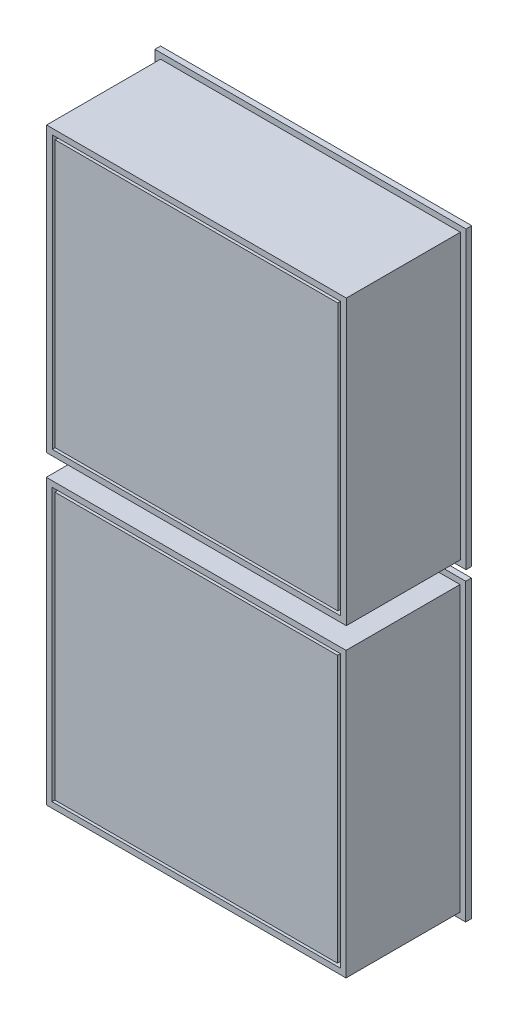
ISO-10303-21;
HEADER;
FILE_DESCRIPTION(('STEP AP214'),'2;1');
FILE_NAME('part.step','',(''),(''),'','','');
FILE_SCHEMA(('AUTOMOTIVE_DESIGN { 1 0 10303 214 1 1 1 1 }'));
ENDSEC;
DATA;
#1=APPLICATION_CONTEXT('core data for automotive mechanical design processes');
#2=APPLICATION_PROTOCOL_DEFINITION('international standard','automotive_design',2000,#1);
#3=PRODUCT_CONTEXT('',#1,'mechanical');
#4=PRODUCT('Part','Part','',(#3));
#5=PRODUCT_RELATED_PRODUCT_CATEGORY('part','',(#4));
#6=PRODUCT_DEFINITION_FORMATION('','',#4);
#7=PRODUCT_DEFINITION_CONTEXT('part definition',#1,'design');
#8=PRODUCT_DEFINITION('design','',#6,#7);
#9=PRODUCT_DEFINITION_SHAPE('','',#8);
#10=(LENGTH_UNIT() NAMED_UNIT(*) SI_UNIT(.MILLI.,.METRE.));
#11=(NAMED_UNIT(*) PLANE_ANGLE_UNIT() SI_UNIT($,.RADIAN.));
#12=(NAMED_UNIT(*) SI_UNIT($,.STERADIAN.) SOLID_ANGLE_UNIT());
#13=UNCERTAINTY_MEASURE_WITH_UNIT(LENGTH_MEASURE(1.E-05),#10,'distance_accuracy_value','');
#14=(GEOMETRIC_REPRESENTATION_CONTEXT(3) GLOBAL_UNCERTAINTY_ASSIGNED_CONTEXT((#13)) GLOBAL_UNIT_ASSIGNED_CONTEXT((#10,
#11,#12)) REPRESENTATION_CONTEXT('',''));
#15=CARTESIAN_POINT('',(0.,0.,0.));
#16=DIRECTION('',(0.,0.,1.));
#17=DIRECTION('',(1.,0.,0.));
#18=AXIS2_PLACEMENT_3D('',#15,#16,#17);
#19=CARTESIAN_POINT('',(-26.4387864536096,-13.9806319519483,20.));
#20=DIRECTION('',(1.,0.,0.));
#21=DIRECTION('',(0.,1.,0.));
#22=AXIS2_PLACEMENT_3D('',#19,#20,#21);
#23=PLANE('',#22);
#24=DIRECTION('',(0.,-1.,0.));
#25=VECTOR('',#24,1.);
#26=CARTESIAN_POINT('',(-26.4387864536096,-13.9806319519483,0.));
#27=LINE('',#26,#25);
#28=CARTESIAN_POINT('',(-26.4387864536096,-13.9806319519483,0.));
#29=VERTEX_POINT('',#28);
#30=CARTESIAN_POINT('',(-26.4387864536096,-63.7589492543294,0.));
#31=VERTEX_POINT('',#30);
#32=EDGE_CURVE('E173',#29,#31,#27,.T.);
#33=ORIENTED_EDGE('',*,*,#32,.T.);
#34=DIRECTION('',(0.,0.,-1.));
#35=VECTOR('',#34,1.);
#36=CARTESIAN_POINT('',(-26.4387864536096,-63.7589492543294,20.));
#37=LINE('',#36,#35);
#38=CARTESIAN_POINT('',(-26.4387864536096,-63.7589492543294,20.));
#39=VERTEX_POINT('',#38);
#40=EDGE_CURVE('E180',#39,#31,#37,.T.);
#41=ORIENTED_EDGE('',*,*,#40,.F.);
#42=DIRECTION('',(0.,-1.,0.));
#43=VECTOR('',#42,1.);
#44=CARTESIAN_POINT('',(-26.4387864536096,-13.9806319519483,20.));
#45=LINE('',#44,#43);
#46=CARTESIAN_POINT('',(-26.4387864536096,-13.9806319519483,20.));
#47=VERTEX_POINT('',#46);
#48=EDGE_CURVE('E111',#47,#39,#45,.T.);
#49=ORIENTED_EDGE('',*,*,#48,.F.);
#50=DIRECTION('',(0.,0.,-1.));
#51=VECTOR('',#50,1.);
#52=CARTESIAN_POINT('',(-26.4387864536096,-13.9806319519483,20.));
#53=LINE('',#52,#51);
#54=EDGE_CURVE('E176',#47,#29,#53,.T.);
#55=ORIENTED_EDGE('',*,*,#54,.T.);
#56=EDGE_LOOP('',(#33,#41,#49,#55));
#57=FACE_BOUND('',#56,.T.);
#58=ADVANCED_FACE('F46',(#57),#23,.F.);
#59=CARTESIAN_POINT('',(26.1453716756386,-63.7589492543294,20.));
#60=DIRECTION('',(0.,1.,0.));
#61=DIRECTION('',(0.,0.,1.));
#62=AXIS2_PLACEMENT_3D('',#59,#60,#61);
#63=PLANE('',#62);
#64=DIRECTION('',(1.,0.,0.));
#65=VECTOR('',#64,1.);
#66=CARTESIAN_POINT('',(26.1453716756386,-63.7589492543294,0.));
#67=LINE('',#66,#65);
#68=CARTESIAN_POINT('',(26.1453716756386,-63.7589492543294,0.));
#69=VERTEX_POINT('',#68);
#70=EDGE_CURVE('E177',#31,#69,#67,.T.);
#71=ORIENTED_EDGE('',*,*,#70,.T.);
#72=DIRECTION('',(0.,0.,-1.));
#73=VECTOR('',#72,1.);
#74=CARTESIAN_POINT('',(26.1453716756386,-63.7589492543294,20.));
#75=LINE('',#74,#73);
#76=CARTESIAN_POINT('',(26.1453716756386,-63.7589492543294,20.));
#77=VERTEX_POINT('',#76);
#78=EDGE_CURVE('E184',#77,#69,#75,.T.);
#79=ORIENTED_EDGE('',*,*,#78,.F.);
#80=DIRECTION('',(1.,0.,0.));
#81=VECTOR('',#80,1.);
#82=CARTESIAN_POINT('',(26.1453716756386,-63.7589492543294,20.));
#83=LINE('',#82,#81);
#84=EDGE_CURVE('E165',#39,#77,#83,.T.);
#85=ORIENTED_EDGE('',*,*,#84,.F.);
#86=ORIENTED_EDGE('',*,*,#40,.T.);
#87=EDGE_LOOP('',(#71,#79,#85,#86));
#88=FACE_BOUND('',#87,.T.);
#89=ADVANCED_FACE('F199',(#88),#63,.F.);
#90=CARTESIAN_POINT('',(26.1453716756386,-13.9806319519483,20.));
#91=DIRECTION('',(-1.,0.,0.));
#92=DIRECTION('',(0.,-1.,0.));
#93=AXIS2_PLACEMENT_3D('',#90,#91,#92);
#94=PLANE('',#93);
#95=DIRECTION('',(0.,1.,0.));
#96=VECTOR('',#95,1.);
#97=CARTESIAN_POINT('',(26.1453716756386,-13.9806319519483,0.));
#98=LINE('',#97,#96);
#99=CARTESIAN_POINT('',(26.1453716756386,-13.9806319519483,0.));
#100=VERTEX_POINT('',#99);
#101=EDGE_CURVE('E181',#69,#100,#98,.T.);
#102=ORIENTED_EDGE('',*,*,#101,.T.);
#103=DIRECTION('',(0.,0.,-1.));
#104=VECTOR('',#103,1.);
#105=CARTESIAN_POINT('',(26.1453716756386,-13.9806319519483,20.));
#106=LINE('',#105,#104);
#107=CARTESIAN_POINT('',(26.1453716756386,-13.9806319519483,20.));
#108=VERTEX_POINT('',#107);
#109=EDGE_CURVE('E109',#108,#100,#106,.T.);
#110=ORIENTED_EDGE('',*,*,#109,.F.);
#111=DIRECTION('',(0.,1.,0.));
#112=VECTOR('',#111,1.);
#113=CARTESIAN_POINT('',(26.1453716756386,-13.9806319519483,20.));
#114=LINE('',#113,#112);
#115=EDGE_CURVE('E168',#77,#108,#114,.T.);
#116=ORIENTED_EDGE('',*,*,#115,.F.);
#117=ORIENTED_EDGE('',*,*,#78,.T.);
#118=EDGE_LOOP('',(#102,#110,#116,#117));
#119=FACE_BOUND('',#118,.T.);
#120=ADVANCED_FACE('F228',(#119),#94,.F.);
#121=CARTESIAN_POINT('',(26.1453716756386,-13.9806319519483,20.));
#122=DIRECTION('',(0.,-1.,0.));
#123=DIRECTION('',(1.,0.,0.));
#124=AXIS2_PLACEMENT_3D('',#121,#122,#123);
#125=PLANE('',#124);
#126=DIRECTION('',(-1.,0.,0.));
#127=VECTOR('',#126,1.);
#128=CARTESIAN_POINT('',(26.1453716756386,-13.9806319519483,0.));
#129=LINE('',#128,#127);
#130=EDGE_CURVE('E185',#100,#29,#129,.T.);
#131=ORIENTED_EDGE('',*,*,#130,.T.);
#132=ORIENTED_EDGE('',*,*,#54,.F.);
#133=DIRECTION('',(-1.,0.,0.));
#134=VECTOR('',#133,1.);
#135=CARTESIAN_POINT('',(26.1453716756386,-13.9806319519483,20.));
#136=LINE('',#135,#134);
#137=EDGE_CURVE('E143',#108,#47,#136,.T.);
#138=ORIENTED_EDGE('',*,*,#137,.F.);
#139=ORIENTED_EDGE('',*,*,#109,.T.);
#140=EDGE_LOOP('',(#131,#132,#138,#139));
#141=FACE_BOUND('',#140,.T.);
#142=ADVANCED_FACE('F220',(#141),#125,.F.);
#143=CARTESIAN_POINT('',(0.,0.,20.));
#144=DIRECTION('',(0.,0.,-1.));
#145=DIRECTION('',(-1.,0.,0.));
#146=AXIS2_PLACEMENT_3D('',#143,#144,#145);
#147=PLANE('',#146);
#148=DIRECTION('',(0.,1.,0.));
#149=VECTOR('',#148,1.);
#150=CARTESIAN_POINT('',(-25.4387864536096,-62.7589492543294,20.));
#151=LINE('',#150,#149);
#152=CARTESIAN_POINT('',(-25.4387864536096,-62.7589492543294,20.));
#153=VERTEX_POINT('',#152);
#154=CARTESIAN_POINT('',(-25.4387864536096,-14.9806319519483,20.));
#155=VERTEX_POINT('',#154);
#156=EDGE_CURVE('E87',#153,#155,#151,.T.);
#157=ORIENTED_EDGE('',*,*,#156,.T.);
#158=DIRECTION('',(1.,0.,0.));
#159=VECTOR('',#158,1.);
#160=CARTESIAN_POINT('',(-25.4387864536096,-14.9806319519483,20.));
#161=LINE('',#160,#159);
#162=CARTESIAN_POINT('',(25.1453716756386,-14.9806319519483,20.));
#163=VERTEX_POINT('',#162);
#164=EDGE_CURVE('E50',#155,#163,#161,.T.);
#165=ORIENTED_EDGE('',*,*,#164,.T.);
#166=DIRECTION('',(0.,-1.,0.));
#167=VECTOR('',#166,1.);
#168=CARTESIAN_POINT('',(25.1453716756386,-14.9806319519483,20.));
#169=LINE('',#168,#167);
#170=CARTESIAN_POINT('',(25.1453716756386,-62.7589492543294,20.));
#171=VERTEX_POINT('',#170);
#172=EDGE_CURVE('E112',#163,#171,#169,.T.);
#173=ORIENTED_EDGE('',*,*,#172,.T.);
#174=DIRECTION('',(-1.,0.,0.));
#175=VECTOR('',#174,1.);
#176=CARTESIAN_POINT('',(25.1453716756386,-62.7589492543294,20.));
#177=LINE('',#176,#175);
#178=EDGE_CURVE('E110',#171,#153,#177,.T.);
#179=ORIENTED_EDGE('',*,*,#178,.T.);
#180=EDGE_LOOP('',(#157,#165,#173,#179));
#181=FACE_BOUND('',#180,.T.);
#182=ORIENTED_EDGE('',*,*,#48,.T.);
#183=ORIENTED_EDGE('',*,*,#84,.T.);
#184=ORIENTED_EDGE('',*,*,#115,.T.);
#185=ORIENTED_EDGE('',*,*,#137,.T.);
#186=EDGE_LOOP('',(#182,#183,#184,#185));
#187=FACE_BOUND('',#186,.T.);
#188=ADVANCED_FACE('F48',(#181,#187),#147,.F.);
#189=CARTESIAN_POINT('',(27.1453716756386,-12.9806319519483,-1.));
#190=DIRECTION('',(-1.,0.,0.));
#191=DIRECTION('',(0.,-1.,0.));
#192=AXIS2_PLACEMENT_3D('',#189,#190,#191);
#193=PLANE('',#192);
#194=DIRECTION('',(0.,-1.,0.));
#195=VECTOR('',#194,1.);
#196=CARTESIAN_POINT('',(27.1453716756386,-12.9806319519483,0.));
#197=LINE('',#196,#195);
#198=CARTESIAN_POINT('',(27.1453716756386,-12.9806319519483,0.));
#199=VERTEX_POINT('',#198);
#200=CARTESIAN_POINT('',(27.1453716756386,-64.7589492543294,0.));
#201=VERTEX_POINT('',#200);
#202=EDGE_CURVE('E139',#199,#201,#197,.T.);
#203=ORIENTED_EDGE('',*,*,#202,.T.);
#204=DIRECTION('',(0.,0.,1.));
#205=VECTOR('',#204,1.);
#206=CARTESIAN_POINT('',(27.1453716756386,-64.7589492543294,-1.));
#207=LINE('',#206,#205);
#208=CARTESIAN_POINT('',(27.1453716756386,-64.7589492543294,-1.));
#209=VERTEX_POINT('',#208);
#210=EDGE_CURVE('E147',#209,#201,#207,.T.);
#211=ORIENTED_EDGE('',*,*,#210,.F.);
#212=DIRECTION('',(0.,-1.,0.));
#213=VECTOR('',#212,1.);
#214=CARTESIAN_POINT('',(27.1453716756386,-12.9806319519483,-1.));
#215=LINE('',#214,#213);
#216=CARTESIAN_POINT('',(27.1453716756386,-12.9806319519483,-1.));
#217=VERTEX_POINT('',#216);
#218=EDGE_CURVE('E127',#217,#209,#215,.T.);
#219=ORIENTED_EDGE('',*,*,#218,.F.);
#220=DIRECTION('',(0.,0.,1.));
#221=VECTOR('',#220,1.);
#222=CARTESIAN_POINT('',(27.1453716756386,-12.9806319519483,-1.));
#223=LINE('',#222,#221);
#224=EDGE_CURVE('E142',#217,#199,#223,.T.);
#225=ORIENTED_EDGE('',*,*,#224,.T.);
#226=EDGE_LOOP('',(#203,#211,#219,#225));
#227=FACE_BOUND('',#226,.T.);
#228=ADVANCED_FACE('F260',(#227),#193,.F.);
#229=CARTESIAN_POINT('',(27.1453716756386,-64.7589492543294,-1.));
#230=DIRECTION('',(0.,1.,0.));
#231=DIRECTION('',(0.,0.,1.));
#232=AXIS2_PLACEMENT_3D('',#229,#230,#231);
#233=PLANE('',#232);
#234=DIRECTION('',(-1.,0.,0.));
#235=VECTOR('',#234,1.);
#236=CARTESIAN_POINT('',(27.1453716756386,-64.7589492543294,0.));
#237=LINE('',#236,#235);
#238=CARTESIAN_POINT('',(-27.4387864536096,-64.7589492543294,0.));
#239=VERTEX_POINT('',#238);
#240=EDGE_CURVE('E144',#201,#239,#237,.T.);
#241=ORIENTED_EDGE('',*,*,#240,.T.);
#242=DIRECTION('',(0.,0.,1.));
#243=VECTOR('',#242,1.);
#244=CARTESIAN_POINT('',(-27.4387864536096,-64.7589492543294,-1.));
#245=LINE('',#244,#243);
#246=CARTESIAN_POINT('',(-27.4387864536096,-64.7589492543294,-1.));
#247=VERTEX_POINT('',#246);
#248=EDGE_CURVE('E151',#247,#239,#245,.T.);
#249=ORIENTED_EDGE('',*,*,#248,.F.);
#250=DIRECTION('',(-1.,0.,0.));
#251=VECTOR('',#250,1.);
#252=CARTESIAN_POINT('',(27.1453716756386,-64.7589492543294,-1.));
#253=LINE('',#252,#251);
#254=EDGE_CURVE('E130',#209,#247,#253,.T.);
#255=ORIENTED_EDGE('',*,*,#254,.F.);
#256=ORIENTED_EDGE('',*,*,#210,.T.);
#257=EDGE_LOOP('',(#241,#249,#255,#256));
#258=FACE_BOUND('',#257,.T.);
#259=ADVANCED_FACE('F253',(#258),#233,.F.);
#260=CARTESIAN_POINT('',(-27.4387864536096,-64.7589492543294,-1.));
#261=DIRECTION('',(1.,0.,0.));
#262=DIRECTION('',(0.,1.,0.));
#263=AXIS2_PLACEMENT_3D('',#260,#261,#262);
#264=PLANE('',#263);
#265=DIRECTION('',(0.,1.,0.));
#266=VECTOR('',#265,1.);
#267=CARTESIAN_POINT('',(-27.4387864536096,-64.7589492543294,0.));
#268=LINE('',#267,#266);
#269=CARTESIAN_POINT('',(-27.4387864536096,-12.9806319519483,0.));
#270=VERTEX_POINT('',#269);
#271=EDGE_CURVE('E148',#239,#270,#268,.T.);
#272=ORIENTED_EDGE('',*,*,#271,.T.);
#273=DIRECTION('',(0.,0.,1.));
#274=VECTOR('',#273,1.);
#275=CARTESIAN_POINT('',(-27.4387864536096,-12.9806319519483,-1.));
#276=LINE('',#275,#274);
#277=CARTESIAN_POINT('',(-27.4387864536096,-12.9806319519483,-1.));
#278=VERTEX_POINT('',#277);
#279=EDGE_CURVE('E131',#278,#270,#276,.T.);
#280=ORIENTED_EDGE('',*,*,#279,.F.);
#281=DIRECTION('',(0.,1.,0.));
#282=VECTOR('',#281,1.);
#283=CARTESIAN_POINT('',(-27.4387864536096,-64.7589492543294,-1.));
#284=LINE('',#283,#282);
#285=EDGE_CURVE('E134',#247,#278,#284,.T.);
#286=ORIENTED_EDGE('',*,*,#285,.F.);
#287=ORIENTED_EDGE('',*,*,#248,.T.);
#288=EDGE_LOOP('',(#272,#280,#286,#287));
#289=FACE_BOUND('',#288,.T.);
#290=ADVANCED_FACE('F265',(#289),#264,.F.);
#291=CARTESIAN_POINT('',(-27.4387864536096,-12.9806319519483,-1.));
#292=DIRECTION('',(0.,-1.,0.));
#293=DIRECTION('',(1.,0.,0.));
#294=AXIS2_PLACEMENT_3D('',#291,#292,#293);
#295=PLANE('',#294);
#296=DIRECTION('',(1.,0.,0.));
#297=VECTOR('',#296,1.);
#298=CARTESIAN_POINT('',(-27.4387864536096,-12.9806319519483,0.));
#299=LINE('',#298,#297);
#300=EDGE_CURVE('E152',#270,#199,#299,.T.);
#301=ORIENTED_EDGE('',*,*,#300,.T.);
#302=ORIENTED_EDGE('',*,*,#224,.F.);
#303=DIRECTION('',(1.,0.,0.));
#304=VECTOR('',#303,1.);
#305=CARTESIAN_POINT('',(-27.4387864536096,-12.9806319519483,-1.));
#306=LINE('',#305,#304);
#307=EDGE_CURVE('E107',#278,#217,#306,.T.);
#308=ORIENTED_EDGE('',*,*,#307,.F.);
#309=ORIENTED_EDGE('',*,*,#279,.T.);
#310=EDGE_LOOP('',(#301,#302,#308,#309));
#311=FACE_BOUND('',#310,.T.);
#312=ADVANCED_FACE('F268',(#311),#295,.F.);
#313=CARTESIAN_POINT('',(0.,0.,-1.));
#314=DIRECTION('',(0.,0.,-1.));
#315=DIRECTION('',(-1.,0.,0.));
#316=AXIS2_PLACEMENT_3D('',#313,#314,#315);
#317=PLANE('',#316);
#318=DIRECTION('',(1.,0.,0.));
#319=VECTOR('',#318,1.);
#320=CARTESIAN_POINT('',(-25.4387864536096,-14.9806319519483,-1.));
#321=LINE('',#320,#319);
#322=CARTESIAN_POINT('',(-25.4387864536096,-14.9806319519483,-1.));
#323=VERTEX_POINT('',#322);
#324=CARTESIAN_POINT('',(25.1453716756386,-14.9806319519483,-1.));
#325=VERTEX_POINT('',#324);
#326=EDGE_CURVE('E99',#323,#325,#321,.T.);
#327=ORIENTED_EDGE('',*,*,#326,.F.);
#328=DIRECTION('',(0.,1.,0.));
#329=VECTOR('',#328,1.);
#330=CARTESIAN_POINT('',(-25.4387864536096,-62.7589492543294,-1.));
#331=LINE('',#330,#329);
#332=CARTESIAN_POINT('',(-25.4387864536096,-62.7589492543294,-1.));
#333=VERTEX_POINT('',#332);
#334=EDGE_CURVE('E84',#333,#323,#331,.T.);
#335=ORIENTED_EDGE('',*,*,#334,.F.);
#336=DIRECTION('',(-1.,0.,0.));
#337=VECTOR('',#336,1.);
#338=CARTESIAN_POINT('',(25.1453716756386,-62.7589492543294,-1.));
#339=LINE('',#338,#337);
#340=CARTESIAN_POINT('',(25.1453716756386,-62.7589492543294,-1.));
#341=VERTEX_POINT('',#340);
#342=EDGE_CURVE('E89',#341,#333,#339,.T.);
#343=ORIENTED_EDGE('',*,*,#342,.F.);
#344=DIRECTION('',(0.,-1.,0.));
#345=VECTOR('',#344,1.);
#346=CARTESIAN_POINT('',(25.1453716756386,-14.9806319519483,-1.));
#347=LINE('',#346,#345);
#348=EDGE_CURVE('E56',#325,#341,#347,.T.);
#349=ORIENTED_EDGE('',*,*,#348,.F.);
#350=EDGE_LOOP('',(#327,#335,#343,#349));
#351=FACE_BOUND('',#350,.T.);
#352=ORIENTED_EDGE('',*,*,#218,.T.);
#353=ORIENTED_EDGE('',*,*,#254,.T.);
#354=ORIENTED_EDGE('',*,*,#285,.T.);
#355=ORIENTED_EDGE('',*,*,#307,.T.);
#356=EDGE_LOOP('',(#352,#353,#354,#355));
#357=FACE_BOUND('',#356,.T.);
#358=ADVANCED_FACE('F96',(#351,#357),#317,.T.);
#359=CARTESIAN_POINT('',(0.,0.,0.));
#360=DIRECTION('',(0.,0.,-1.));
#361=DIRECTION('',(-1.,0.,0.));
#362=AXIS2_PLACEMENT_3D('',#359,#360,#361);
#363=PLANE('',#362);
#364=ORIENTED_EDGE('',*,*,#32,.F.);
#365=ORIENTED_EDGE('',*,*,#130,.F.);
#366=ORIENTED_EDGE('',*,*,#101,.F.);
#367=ORIENTED_EDGE('',*,*,#70,.F.);
#368=EDGE_LOOP('',(#364,#365,#366,#367));
#369=FACE_BOUND('',#368,.T.);
#370=ORIENTED_EDGE('',*,*,#202,.F.);
#371=ORIENTED_EDGE('',*,*,#300,.F.);
#372=ORIENTED_EDGE('',*,*,#271,.F.);
#373=ORIENTED_EDGE('',*,*,#240,.F.);
#374=EDGE_LOOP('',(#370,#371,#372,#373));
#375=FACE_BOUND('',#374,.T.);
#376=ADVANCED_FACE('F213',(#369,#375),#363,.F.);
#377=CARTESIAN_POINT('',(-25.4387864536096,-14.9806319519483,20.));
#378=DIRECTION('',(0.,1.,0.));
#379=DIRECTION('',(-1.,0.,0.));
#380=AXIS2_PLACEMENT_3D('',#377,#378,#379);
#381=PLANE('',#380);
#382=ORIENTED_EDGE('',*,*,#326,.T.);
#383=DIRECTION('',(0.,0.,-1.));
#384=VECTOR('',#383,1.);
#385=CARTESIAN_POINT('',(25.1453716756386,-14.9806319519483,20.));
#386=LINE('',#385,#384);
#387=EDGE_CURVE('E12',#163,#325,#386,.T.);
#388=ORIENTED_EDGE('',*,*,#387,.F.);
#389=ORIENTED_EDGE('',*,*,#164,.F.);
#390=DIRECTION('',(0.,0.,-1.));
#391=VECTOR('',#390,1.);
#392=CARTESIAN_POINT('',(-25.4387864536096,-14.9806319519483,20.));
#393=LINE('',#392,#391);
#394=EDGE_CURVE('E100',#155,#323,#393,.T.);
#395=ORIENTED_EDGE('',*,*,#394,.T.);
#396=EDGE_LOOP('',(#382,#388,#389,#395));
#397=FACE_BOUND('',#396,.T.);
#398=ADVANCED_FACE('F122',(#397),#381,.F.);
#399=CARTESIAN_POINT('',(-25.4387864536096,-62.7589492543294,20.));
#400=DIRECTION('',(-1.,0.,0.));
#401=DIRECTION('',(0.,-1.,0.));
#402=AXIS2_PLACEMENT_3D('',#399,#400,#401);
#403=PLANE('',#402);
#404=ORIENTED_EDGE('',*,*,#334,.T.);
#405=ORIENTED_EDGE('',*,*,#394,.F.);
#406=ORIENTED_EDGE('',*,*,#156,.F.);
#407=DIRECTION('',(0.,0.,-1.));
#408=VECTOR('',#407,1.);
#409=CARTESIAN_POINT('',(-25.4387864536096,-62.7589492543294,20.));
#410=LINE('',#409,#408);
#411=EDGE_CURVE('E78',#153,#333,#410,.T.);
#412=ORIENTED_EDGE('',*,*,#411,.T.);
#413=EDGE_LOOP('',(#404,#405,#406,#412));
#414=FACE_BOUND('',#413,.T.);
#415=ADVANCED_FACE('F82',(#414),#403,.F.);
#416=CARTESIAN_POINT('',(25.1453716756386,-62.7589492543294,20.));
#417=DIRECTION('',(0.,-1.,0.));
#418=DIRECTION('',(0.,0.,-1.));
#419=AXIS2_PLACEMENT_3D('',#416,#417,#418);
#420=PLANE('',#419);
#421=ORIENTED_EDGE('',*,*,#342,.T.);
#422=ORIENTED_EDGE('',*,*,#411,.F.);
#423=ORIENTED_EDGE('',*,*,#178,.F.);
#424=DIRECTION('',(0.,0.,-1.));
#425=VECTOR('',#424,1.);
#426=CARTESIAN_POINT('',(25.1453716756386,-62.7589492543294,20.));
#427=LINE('',#426,#425);
#428=EDGE_CURVE('E65',#171,#341,#427,.T.);
#429=ORIENTED_EDGE('',*,*,#428,.T.);
#430=EDGE_LOOP('',(#421,#422,#423,#429));
#431=FACE_BOUND('',#430,.T.);
#432=ADVANCED_FACE('F92',(#431),#420,.F.);
#433=CARTESIAN_POINT('',(25.1453716756386,-14.9806319519483,20.));
#434=DIRECTION('',(1.,0.,0.));
#435=DIRECTION('',(0.,1.,0.));
#436=AXIS2_PLACEMENT_3D('',#433,#434,#435);
#437=PLANE('',#436);
#438=ORIENTED_EDGE('',*,*,#348,.T.);
#439=ORIENTED_EDGE('',*,*,#428,.F.);
#440=ORIENTED_EDGE('',*,*,#172,.F.);
#441=ORIENTED_EDGE('',*,*,#387,.T.);
#442=EDGE_LOOP('',(#438,#439,#440,#441));
#443=FACE_BOUND('',#442,.T.);
#444=ADVANCED_FACE('F124',(#443),#437,.F.);
#445=CLOSED_SHELL('',(#58,#89,#120,#142,#188,#228,#259,#290,#312,#358,#376,#398,#415,#432,#444));
#446=MANIFOLD_SOLID_BREP('B2',#445);
#447=CARTESIAN_POINT('',(-26.3854472018753,39.5674846662498,20.));
#448=DIRECTION('',(1.,0.,0.));
#449=DIRECTION('',(0.,1.,0.));
#450=AXIS2_PLACEMENT_3D('',#447,#448,#449);
#451=PLANE('',#450);
#452=DIRECTION('',(0.,-1.,0.));
#453=VECTOR('',#452,1.);
#454=CARTESIAN_POINT('',(-26.3854472018753,39.5674846662498,0.));
#455=LINE('',#454,#453);
#456=CARTESIAN_POINT('',(-26.3854472018753,39.5674846662498,0.));
#457=VERTEX_POINT('',#456);
#458=CARTESIAN_POINT('',(-26.3854472018753,-10.2108326361312,0.));
#459=VERTEX_POINT('',#458);
#460=EDGE_CURVE('E528',#457,#459,#455,.T.);
#461=ORIENTED_EDGE('',*,*,#460,.T.);
#462=DIRECTION('',(0.,0.,-1.));
#463=VECTOR('',#462,1.);
#464=CARTESIAN_POINT('',(-26.3854472018753,-10.2108326361312,20.));
#465=LINE('',#464,#463);
#466=CARTESIAN_POINT('',(-26.3854472018753,-10.2108326361312,20.));
#467=VERTEX_POINT('',#466);
#468=EDGE_CURVE('E535',#467,#459,#465,.T.);
#469=ORIENTED_EDGE('',*,*,#468,.F.);
#470=DIRECTION('',(0.,-1.,0.));
#471=VECTOR('',#470,1.);
#472=CARTESIAN_POINT('',(-26.3854472018753,39.5674846662498,20.));
#473=LINE('',#472,#471);
#474=CARTESIAN_POINT('',(-26.3854472018753,39.5674846662498,20.));
#475=VERTEX_POINT('',#474);
#476=EDGE_CURVE('E466',#475,#467,#473,.T.);
#477=ORIENTED_EDGE('',*,*,#476,.F.);
#478=DIRECTION('',(0.,0.,-1.));
#479=VECTOR('',#478,1.);
#480=CARTESIAN_POINT('',(-26.3854472018753,39.5674846662498,20.));
#481=LINE('',#480,#479);
#482=EDGE_CURVE('E531',#475,#457,#481,.T.);
#483=ORIENTED_EDGE('',*,*,#482,.T.);
#484=EDGE_LOOP('',(#461,#469,#477,#483));
#485=FACE_BOUND('',#484,.T.);
#486=ADVANCED_FACE('F401',(#485),#451,.F.);
#487=CARTESIAN_POINT('',(26.1987109273726,-10.2108326361312,20.));
#488=DIRECTION('',(0.,1.,0.));
#489=DIRECTION('',(-1.,0.,0.));
#490=AXIS2_PLACEMENT_3D('',#487,#488,#489);
#491=PLANE('',#490);
#492=DIRECTION('',(1.,0.,0.));
#493=VECTOR('',#492,1.);
#494=CARTESIAN_POINT('',(26.1987109273726,-10.2108326361312,0.));
#495=LINE('',#494,#493);
#496=CARTESIAN_POINT('',(26.1987109273726,-10.2108326361312,0.));
#497=VERTEX_POINT('',#496);
#498=EDGE_CURVE('E532',#459,#497,#495,.T.);
#499=ORIENTED_EDGE('',*,*,#498,.T.);
#500=DIRECTION('',(0.,0.,-1.));
#501=VECTOR('',#500,1.);
#502=CARTESIAN_POINT('',(26.1987109273726,-10.2108326361312,20.));
#503=LINE('',#502,#501);
#504=CARTESIAN_POINT('',(26.1987109273726,-10.2108326361312,20.));
#505=VERTEX_POINT('',#504);
#506=EDGE_CURVE('E539',#505,#497,#503,.T.);
#507=ORIENTED_EDGE('',*,*,#506,.F.);
#508=DIRECTION('',(1.,0.,0.));
#509=VECTOR('',#508,1.);
#510=CARTESIAN_POINT('',(26.1987109273726,-10.2108326361312,20.));
#511=LINE('',#510,#509);
#512=EDGE_CURVE('E520',#467,#505,#511,.T.);
#513=ORIENTED_EDGE('',*,*,#512,.F.);
#514=ORIENTED_EDGE('',*,*,#468,.T.);
#515=EDGE_LOOP('',(#499,#507,#513,#514));
#516=FACE_BOUND('',#515,.T.);
#517=ADVANCED_FACE('F554',(#516),#491,.F.);
#518=CARTESIAN_POINT('',(26.1987109273726,39.5674846662498,20.));
#519=DIRECTION('',(-1.,0.,0.));
#520=DIRECTION('',(0.,-1.,0.));
#521=AXIS2_PLACEMENT_3D('',#518,#519,#520);
#522=PLANE('',#521);
#523=DIRECTION('',(0.,1.,0.));
#524=VECTOR('',#523,1.);
#525=CARTESIAN_POINT('',(26.1987109273726,39.5674846662498,0.));
#526=LINE('',#525,#524);
#527=CARTESIAN_POINT('',(26.1987109273726,39.5674846662498,0.));
#528=VERTEX_POINT('',#527);
#529=EDGE_CURVE('E536',#497,#528,#526,.T.);
#530=ORIENTED_EDGE('',*,*,#529,.T.);
#531=DIRECTION('',(0.,0.,-1.));
#532=VECTOR('',#531,1.);
#533=CARTESIAN_POINT('',(26.1987109273726,39.5674846662498,20.));
#534=LINE('',#533,#532);
#535=CARTESIAN_POINT('',(26.1987109273726,39.5674846662498,20.));
#536=VERTEX_POINT('',#535);
#537=EDGE_CURVE('E464',#536,#528,#534,.T.);
#538=ORIENTED_EDGE('',*,*,#537,.F.);
#539=DIRECTION('',(0.,1.,0.));
#540=VECTOR('',#539,1.);
#541=CARTESIAN_POINT('',(26.1987109273726,39.5674846662498,20.));
#542=LINE('',#541,#540);
#543=EDGE_CURVE('E523',#505,#536,#542,.T.);
#544=ORIENTED_EDGE('',*,*,#543,.F.);
#545=ORIENTED_EDGE('',*,*,#506,.T.);
#546=EDGE_LOOP('',(#530,#538,#544,#545));
#547=FACE_BOUND('',#546,.T.);
#548=ADVANCED_FACE('F583',(#547),#522,.F.);
#549=CARTESIAN_POINT('',(26.1987109273726,39.5674846662498,20.));
#550=DIRECTION('',(0.,-1.,0.));
#551=DIRECTION('',(0.,0.,-1.));
#552=AXIS2_PLACEMENT_3D('',#549,#550,#551);
#553=PLANE('',#552);
#554=DIRECTION('',(-1.,0.,0.));
#555=VECTOR('',#554,1.);
#556=CARTESIAN_POINT('',(26.1987109273726,39.5674846662498,0.));
#557=LINE('',#556,#555);
#558=EDGE_CURVE('E540',#528,#457,#557,.T.);
#559=ORIENTED_EDGE('',*,*,#558,.T.);
#560=ORIENTED_EDGE('',*,*,#482,.F.);
#561=DIRECTION('',(-1.,0.,0.));
#562=VECTOR('',#561,1.);
#563=CARTESIAN_POINT('',(26.1987109273726,39.5674846662498,20.));
#564=LINE('',#563,#562);
#565=EDGE_CURVE('E498',#536,#475,#564,.T.);
#566=ORIENTED_EDGE('',*,*,#565,.F.);
#567=ORIENTED_EDGE('',*,*,#537,.T.);
#568=EDGE_LOOP('',(#559,#560,#566,#567));
#569=FACE_BOUND('',#568,.T.);
#570=ADVANCED_FACE('F575',(#569),#553,.F.);
#571=CARTESIAN_POINT('',(0.,0.,20.));
#572=DIRECTION('',(0.,0.,-1.));
#573=DIRECTION('',(-1.,0.,0.));
#574=AXIS2_PLACEMENT_3D('',#571,#572,#573);
#575=PLANE('',#574);
#576=DIRECTION('',(1.,0.,0.));
#577=VECTOR('',#576,1.);
#578=CARTESIAN_POINT('',(-25.3854472018753,38.5674846662498,20.));
#579=LINE('',#578,#577);
#580=CARTESIAN_POINT('',(-25.3854472018753,38.5674846662498,20.));
#581=VERTEX_POINT('',#580);
#582=CARTESIAN_POINT('',(25.1987109273726,38.5674846662498,20.));
#583=VERTEX_POINT('',#582);
#584=EDGE_CURVE('E442',#581,#583,#579,.T.);
#585=ORIENTED_EDGE('',*,*,#584,.T.);
#586=DIRECTION('',(0.,-1.,0.));
#587=VECTOR('',#586,1.);
#588=CARTESIAN_POINT('',(25.1987109273726,38.5674846662498,20.));
#589=LINE('',#588,#587);
#590=CARTESIAN_POINT('',(25.1987109273726,-9.21083263613122,20.));
#591=VERTEX_POINT('',#590);
#592=EDGE_CURVE('E405',#583,#591,#589,.T.);
#593=ORIENTED_EDGE('',*,*,#592,.T.);
#594=DIRECTION('',(-1.,0.,0.));
#595=VECTOR('',#594,1.);
#596=CARTESIAN_POINT('',(25.1987109273726,-9.21083263613122,20.));
#597=LINE('',#596,#595);
#598=CARTESIAN_POINT('',(-25.3854472018753,-9.21083263613123,20.));
#599=VERTEX_POINT('',#598);
#600=EDGE_CURVE('E467',#591,#599,#597,.T.);
#601=ORIENTED_EDGE('',*,*,#600,.T.);
#602=DIRECTION('',(0.,1.,0.));
#603=VECTOR('',#602,1.);
#604=CARTESIAN_POINT('',(-25.3854472018753,-9.21083263613123,20.));
#605=LINE('',#604,#603);
#606=EDGE_CURVE('E465',#599,#581,#605,.T.);
#607=ORIENTED_EDGE('',*,*,#606,.T.);
#608=EDGE_LOOP('',(#585,#593,#601,#607));
#609=FACE_BOUND('',#608,.T.);
#610=ORIENTED_EDGE('',*,*,#476,.T.);
#611=ORIENTED_EDGE('',*,*,#512,.T.);
#612=ORIENTED_EDGE('',*,*,#543,.T.);
#613=ORIENTED_EDGE('',*,*,#565,.T.);
#614=EDGE_LOOP('',(#610,#611,#612,#613));
#615=FACE_BOUND('',#614,.T.);
#616=ADVANCED_FACE('F403',(#609,#615),#575,.F.);
#617=CARTESIAN_POINT('',(27.1987109273726,40.5674846662498,-1.));
#618=DIRECTION('',(-1.,0.,0.));
#619=DIRECTION('',(0.,-1.,0.));
#620=AXIS2_PLACEMENT_3D('',#617,#618,#619);
#621=PLANE('',#620);
#622=DIRECTION('',(0.,-1.,0.));
#623=VECTOR('',#622,1.);
#624=CARTESIAN_POINT('',(27.1987109273726,40.5674846662498,0.));
#625=LINE('',#624,#623);
#626=CARTESIAN_POINT('',(27.1987109273726,40.5674846662498,0.));
#627=VERTEX_POINT('',#626);
#628=CARTESIAN_POINT('',(27.1987109273726,-11.2108326361312,0.));
#629=VERTEX_POINT('',#628);
#630=EDGE_CURVE('E494',#627,#629,#625,.T.);
#631=ORIENTED_EDGE('',*,*,#630,.T.);
#632=DIRECTION('',(0.,0.,1.));
#633=VECTOR('',#632,1.);
#634=CARTESIAN_POINT('',(27.1987109273726,-11.2108326361312,-1.));
#635=LINE('',#634,#633);
#636=CARTESIAN_POINT('',(27.1987109273726,-11.2108326361312,-1.));
#637=VERTEX_POINT('',#636);
#638=EDGE_CURVE('E502',#637,#629,#635,.T.);
#639=ORIENTED_EDGE('',*,*,#638,.F.);
#640=DIRECTION('',(0.,-1.,0.));
#641=VECTOR('',#640,1.);
#642=CARTESIAN_POINT('',(27.1987109273726,40.5674846662498,-1.));
#643=LINE('',#642,#641);
#644=CARTESIAN_POINT('',(27.1987109273726,40.5674846662498,-1.));
#645=VERTEX_POINT('',#644);
#646=EDGE_CURVE('E482',#645,#637,#643,.T.);
#647=ORIENTED_EDGE('',*,*,#646,.F.);
#648=DIRECTION('',(0.,0.,1.));
#649=VECTOR('',#648,1.);
#650=CARTESIAN_POINT('',(27.1987109273726,40.5674846662498,-1.));
#651=LINE('',#650,#649);
#652=EDGE_CURVE('E497',#645,#627,#651,.T.);
#653=ORIENTED_EDGE('',*,*,#652,.T.);
#654=EDGE_LOOP('',(#631,#639,#647,#653));
#655=FACE_BOUND('',#654,.T.);
#656=ADVANCED_FACE('F615',(#655),#621,.F.);
#657=CARTESIAN_POINT('',(27.1987109273726,-11.2108326361312,-1.));
#658=DIRECTION('',(0.,1.,0.));
#659=DIRECTION('',(-1.,0.,0.));
#660=AXIS2_PLACEMENT_3D('',#657,#658,#659);
#661=PLANE('',#660);
#662=DIRECTION('',(-1.,0.,0.));
#663=VECTOR('',#662,1.);
#664=CARTESIAN_POINT('',(27.1987109273726,-11.2108326361312,0.));
#665=LINE('',#664,#663);
#666=CARTESIAN_POINT('',(-27.3854472018753,-11.2108326361312,0.));
#667=VERTEX_POINT('',#666);
#668=EDGE_CURVE('E499',#629,#667,#665,.T.);
#669=ORIENTED_EDGE('',*,*,#668,.T.);
#670=DIRECTION('',(0.,0.,1.));
#671=VECTOR('',#670,1.);
#672=CARTESIAN_POINT('',(-27.3854472018753,-11.2108326361312,-1.));
#673=LINE('',#672,#671);
#674=CARTESIAN_POINT('',(-27.3854472018753,-11.2108326361312,-1.));
#675=VERTEX_POINT('',#674);
#676=EDGE_CURVE('E506',#675,#667,#673,.T.);
#677=ORIENTED_EDGE('',*,*,#676,.F.);
#678=DIRECTION('',(-1.,0.,0.));
#679=VECTOR('',#678,1.);
#680=CARTESIAN_POINT('',(27.1987109273726,-11.2108326361312,-1.));
#681=LINE('',#680,#679);
#682=EDGE_CURVE('E485',#637,#675,#681,.T.);
#683=ORIENTED_EDGE('',*,*,#682,.F.);
#684=ORIENTED_EDGE('',*,*,#638,.T.);
#685=EDGE_LOOP('',(#669,#677,#683,#684));
#686=FACE_BOUND('',#685,.T.);
#687=ADVANCED_FACE('F608',(#686),#661,.F.);
#688=CARTESIAN_POINT('',(-27.3854472018753,-11.2108326361312,-1.));
#689=DIRECTION('',(1.,0.,0.));
#690=DIRECTION('',(0.,1.,0.));
#691=AXIS2_PLACEMENT_3D('',#688,#689,#690);
#692=PLANE('',#691);
#693=DIRECTION('',(0.,1.,0.));
#694=VECTOR('',#693,1.);
#695=CARTESIAN_POINT('',(-27.3854472018753,-11.2108326361312,0.));
#696=LINE('',#695,#694);
#697=CARTESIAN_POINT('',(-27.3854472018753,40.5674846662498,0.));
#698=VERTEX_POINT('',#697);
#699=EDGE_CURVE('E503',#667,#698,#696,.T.);
#700=ORIENTED_EDGE('',*,*,#699,.T.);
#701=DIRECTION('',(0.,0.,1.));
#702=VECTOR('',#701,1.);
#703=CARTESIAN_POINT('',(-27.3854472018753,40.5674846662498,-1.));
#704=LINE('',#703,#702);
#705=CARTESIAN_POINT('',(-27.3854472018753,40.5674846662498,-1.));
#706=VERTEX_POINT('',#705);
#707=EDGE_CURVE('E486',#706,#698,#704,.T.);
#708=ORIENTED_EDGE('',*,*,#707,.F.);
#709=DIRECTION('',(0.,1.,0.));
#710=VECTOR('',#709,1.);
#711=CARTESIAN_POINT('',(-27.3854472018753,-11.2108326361312,-1.));
#712=LINE('',#711,#710);
#713=EDGE_CURVE('E489',#675,#706,#712,.T.);
#714=ORIENTED_EDGE('',*,*,#713,.F.);
#715=ORIENTED_EDGE('',*,*,#676,.T.);
#716=EDGE_LOOP('',(#700,#708,#714,#715));
#717=FACE_BOUND('',#716,.T.);
#718=ADVANCED_FACE('F620',(#717),#692,.F.);
#719=CARTESIAN_POINT('',(-27.3854472018753,40.5674846662498,-1.));
#720=DIRECTION('',(0.,-1.,0.));
#721=DIRECTION('',(0.,0.,-1.));
#722=AXIS2_PLACEMENT_3D('',#719,#720,#721);
#723=PLANE('',#722);
#724=DIRECTION('',(1.,0.,0.));
#725=VECTOR('',#724,1.);
#726=CARTESIAN_POINT('',(-27.3854472018753,40.5674846662498,0.));
#727=LINE('',#726,#725);
#728=EDGE_CURVE('E507',#698,#627,#727,.T.);
#729=ORIENTED_EDGE('',*,*,#728,.T.);
#730=ORIENTED_EDGE('',*,*,#652,.F.);
#731=DIRECTION('',(1.,0.,0.));
#732=VECTOR('',#731,1.);
#733=CARTESIAN_POINT('',(-27.3854472018753,40.5674846662498,-1.));
#734=LINE('',#733,#732);
#735=EDGE_CURVE('E462',#706,#645,#734,.T.);
#736=ORIENTED_EDGE('',*,*,#735,.F.);
#737=ORIENTED_EDGE('',*,*,#707,.T.);
#738=EDGE_LOOP('',(#729,#730,#736,#737));
#739=FACE_BOUND('',#738,.T.);
#740=ADVANCED_FACE('F623',(#739),#723,.F.);
#741=CARTESIAN_POINT('',(0.,0.,-1.));
#742=DIRECTION('',(0.,0.,-1.));
#743=DIRECTION('',(-1.,0.,0.));
#744=AXIS2_PLACEMENT_3D('',#741,#742,#743);
#745=PLANE('',#744);
#746=DIRECTION('',(0.,-1.,0.));
#747=VECTOR('',#746,1.);
#748=CARTESIAN_POINT('',(25.1987109273726,38.5674846662498,-1.));
#749=LINE('',#748,#747);
#750=CARTESIAN_POINT('',(25.1987109273726,38.5674846662498,-1.));
#751=VERTEX_POINT('',#750);
#752=CARTESIAN_POINT('',(25.1987109273726,-9.21083263613122,-1.));
#753=VERTEX_POINT('',#752);
#754=EDGE_CURVE('E454',#751,#753,#749,.T.);
#755=ORIENTED_EDGE('',*,*,#754,.F.);
#756=DIRECTION('',(1.,0.,0.));
#757=VECTOR('',#756,1.);
#758=CARTESIAN_POINT('',(-25.3854472018753,38.5674846662498,-1.));
#759=LINE('',#758,#757);
#760=CARTESIAN_POINT('',(-25.3854472018753,38.5674846662498,-1.));
#761=VERTEX_POINT('',#760);
#762=EDGE_CURVE('E439',#761,#751,#759,.T.);
#763=ORIENTED_EDGE('',*,*,#762,.F.);
#764=DIRECTION('',(0.,1.,0.));
#765=VECTOR('',#764,1.);
#766=CARTESIAN_POINT('',(-25.3854472018753,-9.21083263613123,-1.));
#767=LINE('',#766,#765);
#768=CARTESIAN_POINT('',(-25.3854472018753,-9.21083263613123,-1.));
#769=VERTEX_POINT('',#768);
#770=EDGE_CURVE('E444',#769,#761,#767,.T.);
#771=ORIENTED_EDGE('',*,*,#770,.F.);
#772=DIRECTION('',(-1.,0.,0.));
#773=VECTOR('',#772,1.);
#774=CARTESIAN_POINT('',(25.1987109273726,-9.21083263613122,-1.));
#775=LINE('',#774,#773);
#776=EDGE_CURVE('E411',#753,#769,#775,.T.);
#777=ORIENTED_EDGE('',*,*,#776,.F.);
#778=EDGE_LOOP('',(#755,#763,#771,#777));
#779=FACE_BOUND('',#778,.T.);
#780=ORIENTED_EDGE('',*,*,#646,.T.);
#781=ORIENTED_EDGE('',*,*,#682,.T.);
#782=ORIENTED_EDGE('',*,*,#713,.T.);
#783=ORIENTED_EDGE('',*,*,#735,.T.);
#784=EDGE_LOOP('',(#780,#781,#782,#783));
#785=FACE_BOUND('',#784,.T.);
#786=ADVANCED_FACE('F451',(#779,#785),#745,.T.);
#787=CARTESIAN_POINT('',(0.,0.,0.));
#788=DIRECTION('',(0.,0.,-1.));
#789=DIRECTION('',(-1.,0.,0.));
#790=AXIS2_PLACEMENT_3D('',#787,#788,#789);
#791=PLANE('',#790);
#792=ORIENTED_EDGE('',*,*,#460,.F.);
#793=ORIENTED_EDGE('',*,*,#558,.F.);
#794=ORIENTED_EDGE('',*,*,#529,.F.);
#795=ORIENTED_EDGE('',*,*,#498,.F.);
#796=EDGE_LOOP('',(#792,#793,#794,#795));
#797=FACE_BOUND('',#796,.T.);
#798=ORIENTED_EDGE('',*,*,#630,.F.);
#799=ORIENTED_EDGE('',*,*,#728,.F.);
#800=ORIENTED_EDGE('',*,*,#699,.F.);
#801=ORIENTED_EDGE('',*,*,#668,.F.);
#802=EDGE_LOOP('',(#798,#799,#800,#801));
#803=FACE_BOUND('',#802,.T.);
#804=ADVANCED_FACE('F568',(#797,#803),#791,.F.);
#805=CARTESIAN_POINT('',(25.1987109273726,38.5674846662498,20.));
#806=DIRECTION('',(1.,0.,0.));
#807=DIRECTION('',(0.,1.,0.));
#808=AXIS2_PLACEMENT_3D('',#805,#806,#807);
#809=PLANE('',#808);
#810=ORIENTED_EDGE('',*,*,#754,.T.);
#811=DIRECTION('',(0.,0.,-1.));
#812=VECTOR('',#811,1.);
#813=CARTESIAN_POINT('',(25.1987109273726,-9.21083263613122,20.));
#814=LINE('',#813,#812);
#815=EDGE_CURVE('E44',#591,#753,#814,.T.);
#816=ORIENTED_EDGE('',*,*,#815,.F.);
#817=ORIENTED_EDGE('',*,*,#592,.F.);
#818=DIRECTION('',(0.,0.,-1.));
#819=VECTOR('',#818,1.);
#820=CARTESIAN_POINT('',(25.1987109273726,38.5674846662498,20.));
#821=LINE('',#820,#819);
#822=EDGE_CURVE('E455',#583,#751,#821,.T.);
#823=ORIENTED_EDGE('',*,*,#822,.T.);
#824=EDGE_LOOP('',(#810,#816,#817,#823));
#825=FACE_BOUND('',#824,.T.);
#826=ADVANCED_FACE('F477',(#825),#809,.F.);
#827=CARTESIAN_POINT('',(-25.3854472018753,38.5674846662498,20.));
#828=DIRECTION('',(0.,1.,0.));
#829=DIRECTION('',(0.,0.,1.));
#830=AXIS2_PLACEMENT_3D('',#827,#828,#829);
#831=PLANE('',#830);
#832=ORIENTED_EDGE('',*,*,#762,.T.);
#833=ORIENTED_EDGE('',*,*,#822,.F.);
#834=ORIENTED_EDGE('',*,*,#584,.F.);
#835=DIRECTION('',(0.,0.,-1.));
#836=VECTOR('',#835,1.);
#837=CARTESIAN_POINT('',(-25.3854472018753,38.5674846662498,20.));
#838=LINE('',#837,#836);
#839=EDGE_CURVE('E433',#581,#761,#838,.T.);
#840=ORIENTED_EDGE('',*,*,#839,.T.);
#841=EDGE_LOOP('',(#832,#833,#834,#840));
#842=FACE_BOUND('',#841,.T.);
#843=ADVANCED_FACE('F437',(#842),#831,.F.);
#844=CARTESIAN_POINT('',(-25.3854472018753,-9.21083263613123,20.));
#845=DIRECTION('',(-1.,0.,0.));
#846=DIRECTION('',(0.,-1.,0.));
#847=AXIS2_PLACEMENT_3D('',#844,#845,#846);
#848=PLANE('',#847);
#849=ORIENTED_EDGE('',*,*,#770,.T.);
#850=ORIENTED_EDGE('',*,*,#839,.F.);
#851=ORIENTED_EDGE('',*,*,#606,.F.);
#852=DIRECTION('',(0.,0.,-1.));
#853=VECTOR('',#852,1.);
#854=CARTESIAN_POINT('',(-25.3854472018753,-9.21083263613123,20.));
#855=LINE('',#854,#853);
#856=EDGE_CURVE('E420',#599,#769,#855,.T.);
#857=ORIENTED_EDGE('',*,*,#856,.T.);
#858=EDGE_LOOP('',(#849,#850,#851,#857));
#859=FACE_BOUND('',#858,.T.);
#860=ADVANCED_FACE('F447',(#859),#848,.F.);
#861=CARTESIAN_POINT('',(25.1987109273726,-9.21083263613122,20.));
#862=DIRECTION('',(0.,-1.,0.));
#863=DIRECTION('',(1.,0.,0.));
#864=AXIS2_PLACEMENT_3D('',#861,#862,#863);
#865=PLANE('',#864);
#866=ORIENTED_EDGE('',*,*,#776,.T.);
#867=ORIENTED_EDGE('',*,*,#856,.F.);
#868=ORIENTED_EDGE('',*,*,#600,.F.);
#869=ORIENTED_EDGE('',*,*,#815,.T.);
#870=EDGE_LOOP('',(#866,#867,#868,#869));
#871=FACE_BOUND('',#870,.T.);
#872=ADVANCED_FACE('F479',(#871),#865,.F.);
#873=CLOSED_SHELL('',(#486,#517,#548,#570,#616,#656,#687,#718,#740,#786,#804,#826,#843,#860,#872));
#874=MANIFOLD_SOLID_BREP('B6',#873);
#875=CARTESIAN_POINT('',(0.,0.,-1.));
#876=DIRECTION('',(0.,0.,-1.));
#877=DIRECTION('',(-1.,0.,0.));
#878=AXIS2_PLACEMENT_3D('',#875,#876,#877);
#879=PLANE('',#878);
#880=DIRECTION('',(0.,-1.,0.));
#881=VECTOR('',#880,1.);
#882=CARTESIAN_POINT('',(24.6453716756386,-15.4806319519483,-1.));
#883=LINE('',#882,#881);
#884=CARTESIAN_POINT('',(24.6453716756386,-15.4806319519483,-1.));
#885=VERTEX_POINT('',#884);
#886=CARTESIAN_POINT('',(24.6453716756386,-62.2589492543294,-1.));
#887=VERTEX_POINT('',#886);
#888=EDGE_CURVE('E802',#885,#887,#883,.T.);
#889=ORIENTED_EDGE('',*,*,#888,.T.);
#890=DIRECTION('',(-1.,0.,0.));
#891=VECTOR('',#890,1.);
#892=CARTESIAN_POINT('',(24.6453716756386,-62.2589492543294,-1.));
#893=LINE('',#892,#891);
#894=CARTESIAN_POINT('',(-24.9387864536096,-62.2589492543294,-1.));
#895=VERTEX_POINT('',#894);
#896=EDGE_CURVE('E816',#887,#895,#893,.T.);
#897=ORIENTED_EDGE('',*,*,#896,.T.);
#898=DIRECTION('',(0.,1.,0.));
#899=VECTOR('',#898,1.);
#900=CARTESIAN_POINT('',(-24.9387864536096,-62.2589492543294,-1.));
#901=LINE('',#900,#899);
#902=CARTESIAN_POINT('',(-24.9387864536096,-15.4806319519483,-1.));
#903=VERTEX_POINT('',#902);
#904=EDGE_CURVE('E819',#895,#903,#901,.T.);
#905=ORIENTED_EDGE('',*,*,#904,.T.);
#906=DIRECTION('',(1.,0.,0.));
#907=VECTOR('',#906,1.);
#908=CARTESIAN_POINT('',(-24.9387864536096,-15.4806319519483,-1.));
#909=LINE('',#908,#907);
#910=EDGE_CURVE('E780',#903,#885,#909,.T.);
#911=ORIENTED_EDGE('',*,*,#910,.T.);
#912=EDGE_LOOP('',(#889,#897,#905,#911));
#913=FACE_BOUND('',#912,.T.);
#914=ADVANCED_FACE('F755',(#913),#879,.T.);
#915=CARTESIAN_POINT('',(-24.9387864536096,-62.2589492543294,20.));
#916=DIRECTION('',(-1.,0.,0.));
#917=DIRECTION('',(0.,0.,1.));
#918=AXIS2_PLACEMENT_3D('',#915,#916,#917);
#919=PLANE('',#918);
#920=ORIENTED_EDGE('',*,*,#904,.F.);
#921=DIRECTION('',(0.,0.,-1.));
#922=VECTOR('',#921,1.);
#923=CARTESIAN_POINT('',(-24.9387864536096,-62.2589492543294,20.));
#924=LINE('',#923,#922);
#925=CARTESIAN_POINT('',(-24.9387864536096,-62.2589492543294,20.));
#926=VERTEX_POINT('',#925);
#927=EDGE_CURVE('E759',#926,#895,#924,.T.);
#928=ORIENTED_EDGE('',*,*,#927,.F.);
#929=DIRECTION('',(0.,1.,0.));
#930=VECTOR('',#929,1.);
#931=CARTESIAN_POINT('',(-24.9387864536096,-62.2589492543294,20.));
#932=LINE('',#931,#930);
#933=CARTESIAN_POINT('',(-24.9387864536096,-15.4806319519483,20.));
#934=VERTEX_POINT('',#933);
#935=EDGE_CURVE('E811',#926,#934,#932,.T.);
#936=ORIENTED_EDGE('',*,*,#935,.T.);
#937=DIRECTION('',(0.,0.,-1.));
#938=VECTOR('',#937,1.);
#939=CARTESIAN_POINT('',(-24.9387864536096,-15.4806319519483,20.));
#940=LINE('',#939,#938);
#941=EDGE_CURVE('E803',#934,#903,#940,.T.);
#942=ORIENTED_EDGE('',*,*,#941,.T.);
#943=EDGE_LOOP('',(#920,#928,#936,#942));
#944=FACE_BOUND('',#943,.T.);
#945=ADVANCED_FACE('F825',(#944),#919,.T.);
#946=CARTESIAN_POINT('',(-24.9387864536096,-15.4806319519483,20.));
#947=DIRECTION('',(0.,1.,0.));
#948=DIRECTION('',(0.,0.,1.));
#949=AXIS2_PLACEMENT_3D('',#946,#947,#948);
#950=PLANE('',#949);
#951=ORIENTED_EDGE('',*,*,#910,.F.);
#952=ORIENTED_EDGE('',*,*,#941,.F.);
#953=DIRECTION('',(1.,0.,0.));
#954=VECTOR('',#953,1.);
#955=CARTESIAN_POINT('',(-24.9387864536096,-15.4806319519483,20.));
#956=LINE('',#955,#954);
#957=CARTESIAN_POINT('',(24.6453716756386,-15.4806319519483,20.));
#958=VERTEX_POINT('',#957);
#959=EDGE_CURVE('E806',#934,#958,#956,.T.);
#960=ORIENTED_EDGE('',*,*,#959,.T.);
#961=DIRECTION('',(0.,0.,-1.));
#962=VECTOR('',#961,1.);
#963=CARTESIAN_POINT('',(24.6453716756386,-15.4806319519483,20.));
#964=LINE('',#963,#962);
#965=EDGE_CURVE('E764',#958,#885,#964,.T.);
#966=ORIENTED_EDGE('',*,*,#965,.T.);
#967=EDGE_LOOP('',(#951,#952,#960,#966));
#968=FACE_BOUND('',#967,.T.);
#969=ADVANCED_FACE('F807',(#968),#950,.T.);
#970=CARTESIAN_POINT('',(24.6453716756386,-15.4806319519483,20.));
#971=DIRECTION('',(1.,0.,0.));
#972=DIRECTION('',(0.,0.,-1.));
#973=AXIS2_PLACEMENT_3D('',#970,#971,#972);
#974=PLANE('',#973);
#975=ORIENTED_EDGE('',*,*,#888,.F.);
#976=ORIENTED_EDGE('',*,*,#965,.F.);
#977=DIRECTION('',(0.,-1.,0.));
#978=VECTOR('',#977,1.);
#979=CARTESIAN_POINT('',(24.6453716756386,-15.4806319519483,20.));
#980=LINE('',#979,#978);
#981=CARTESIAN_POINT('',(24.6453716756386,-62.2589492543294,20.));
#982=VERTEX_POINT('',#981);
#983=EDGE_CURVE('E800',#958,#982,#980,.T.);
#984=ORIENTED_EDGE('',*,*,#983,.T.);
#985=DIRECTION('',(0.,0.,-1.));
#986=VECTOR('',#985,1.);
#987=CARTESIAN_POINT('',(24.6453716756386,-62.2589492543294,20.));
#988=LINE('',#987,#986);
#989=EDGE_CURVE('E399',#982,#887,#988,.T.);
#990=ORIENTED_EDGE('',*,*,#989,.T.);
#991=EDGE_LOOP('',(#975,#976,#984,#990));
#992=FACE_BOUND('',#991,.T.);
#993=ADVANCED_FACE('F798',(#992),#974,.T.);
#994=CARTESIAN_POINT('',(24.6453716756386,-62.2589492543294,20.));
#995=DIRECTION('',(0.,-1.,0.));
#996=DIRECTION('',(0.,0.,-1.));
#997=AXIS2_PLACEMENT_3D('',#994,#995,#996);
#998=PLANE('',#997);
#999=ORIENTED_EDGE('',*,*,#896,.F.);
#1000=ORIENTED_EDGE('',*,*,#989,.F.);
#1001=DIRECTION('',(-1.,0.,0.));
#1002=VECTOR('',#1001,1.);
#1003=CARTESIAN_POINT('',(24.6453716756386,-62.2589492543294,20.));
#1004=LINE('',#1003,#1002);
#1005=EDGE_CURVE('E772',#982,#926,#1004,.T.);
#1006=ORIENTED_EDGE('',*,*,#1005,.T.);
#1007=ORIENTED_EDGE('',*,*,#927,.T.);
#1008=EDGE_LOOP('',(#999,#1000,#1006,#1007));
#1009=FACE_BOUND('',#1008,.T.);
#1010=ADVANCED_FACE('F828',(#1009),#998,.T.);
#1011=CARTESIAN_POINT('',(0.,0.,20.));
#1012=DIRECTION('',(0.,0.,-1.));
#1013=DIRECTION('',(-1.,0.,0.));
#1014=AXIS2_PLACEMENT_3D('',#1011,#1012,#1013);
#1015=PLANE('',#1014);
#1016=ORIENTED_EDGE('',*,*,#1005,.F.);
#1017=ORIENTED_EDGE('',*,*,#983,.F.);
#1018=ORIENTED_EDGE('',*,*,#959,.F.);
#1019=ORIENTED_EDGE('',*,*,#935,.F.);
#1020=EDGE_LOOP('',(#1016,#1017,#1018,#1019));
#1021=FACE_BOUND('',#1020,.T.);
#1022=ADVANCED_FACE('F757',(#1021),#1015,.F.);
#1023=CLOSED_SHELL('',(#914,#945,#969,#993,#1010,#1022));
#1024=MANIFOLD_SOLID_BREP('B38',#1023);
#1025=CARTESIAN_POINT('',(0.,0.,-1.));
#1026=DIRECTION('',(0.,0.,-1.));
#1027=DIRECTION('',(-1.,0.,0.));
#1028=AXIS2_PLACEMENT_3D('',#1025,#1026,#1027);
#1029=PLANE('',#1028);
#1030=DIRECTION('',(0.,1.,0.));
#1031=VECTOR('',#1030,1.);
#1032=CARTESIAN_POINT('',(-24.8854472018753,-8.71083263613122,-1.));
#1033=LINE('',#1032,#1031);
#1034=CARTESIAN_POINT('',(-24.8854472018753,-8.71083263613122,-1.));
#1035=VERTEX_POINT('',#1034);
#1036=CARTESIAN_POINT('',(-24.8854472018753,38.0674846662498,-1.));
#1037=VERTEX_POINT('',#1036);
#1038=EDGE_CURVE('E928',#1035,#1037,#1033,.T.);
#1039=ORIENTED_EDGE('',*,*,#1038,.T.);
#1040=DIRECTION('',(1.,0.,0.));
#1041=VECTOR('',#1040,1.);
#1042=CARTESIAN_POINT('',(-24.8854472018753,38.0674846662498,-1.));
#1043=LINE('',#1042,#1041);
#1044=CARTESIAN_POINT('',(24.6987109273726,38.0674846662498,-1.));
#1045=VERTEX_POINT('',#1044);
#1046=EDGE_CURVE('E942',#1037,#1045,#1043,.T.);
#1047=ORIENTED_EDGE('',*,*,#1046,.T.);
#1048=DIRECTION('',(0.,-1.,0.));
#1049=VECTOR('',#1048,1.);
#1050=CARTESIAN_POINT('',(24.6987109273726,38.0674846662498,-1.));
#1051=LINE('',#1050,#1049);
#1052=CARTESIAN_POINT('',(24.6987109273726,-8.71083263613122,-1.));
#1053=VERTEX_POINT('',#1052);
#1054=EDGE_CURVE('E945',#1045,#1053,#1051,.T.);
#1055=ORIENTED_EDGE('',*,*,#1054,.T.);
#1056=DIRECTION('',(-1.,0.,0.));
#1057=VECTOR('',#1056,1.);
#1058=CARTESIAN_POINT('',(24.6987109273726,-8.71083263613122,-1.));
#1059=LINE('',#1058,#1057);
#1060=EDGE_CURVE('E906',#1053,#1035,#1059,.T.);
#1061=ORIENTED_EDGE('',*,*,#1060,.T.);
#1062=EDGE_LOOP('',(#1039,#1047,#1055,#1061));
#1063=FACE_BOUND('',#1062,.T.);
#1064=ADVANCED_FACE('F881',(#1063),#1029,.T.);
#1065=CARTESIAN_POINT('',(24.6987109273726,38.0674846662498,20.));
#1066=DIRECTION('',(1.,0.,0.));
#1067=DIRECTION('',(0.,0.,-1.));
#1068=AXIS2_PLACEMENT_3D('',#1065,#1066,#1067);
#1069=PLANE('',#1068);
#1070=ORIENTED_EDGE('',*,*,#1054,.F.);
#1071=DIRECTION('',(0.,0.,-1.));
#1072=VECTOR('',#1071,1.);
#1073=CARTESIAN_POINT('',(24.6987109273726,38.0674846662498,20.));
#1074=LINE('',#1073,#1072);
#1075=CARTESIAN_POINT('',(24.6987109273726,38.0674846662498,20.));
#1076=VERTEX_POINT('',#1075);
#1077=EDGE_CURVE('E885',#1076,#1045,#1074,.T.);
#1078=ORIENTED_EDGE('',*,*,#1077,.F.);
#1079=DIRECTION('',(0.,-1.,0.));
#1080=VECTOR('',#1079,1.);
#1081=CARTESIAN_POINT('',(24.6987109273726,38.0674846662498,20.));
#1082=LINE('',#1081,#1080);
#1083=CARTESIAN_POINT('',(24.6987109273726,-8.71083263613122,20.));
#1084=VERTEX_POINT('',#1083);
#1085=EDGE_CURVE('E937',#1076,#1084,#1082,.T.);
#1086=ORIENTED_EDGE('',*,*,#1085,.T.);
#1087=DIRECTION('',(0.,0.,-1.));
#1088=VECTOR('',#1087,1.);
#1089=CARTESIAN_POINT('',(24.6987109273726,-8.71083263613122,20.));
#1090=LINE('',#1089,#1088);
#1091=EDGE_CURVE('E929',#1084,#1053,#1090,.T.);
#1092=ORIENTED_EDGE('',*,*,#1091,.T.);
#1093=EDGE_LOOP('',(#1070,#1078,#1086,#1092));
#1094=FACE_BOUND('',#1093,.T.);
#1095=ADVANCED_FACE('F951',(#1094),#1069,.T.);
#1096=CARTESIAN_POINT('',(24.6987109273726,-8.71083263613122,20.));
#1097=DIRECTION('',(0.,-1.,0.));
#1098=DIRECTION('',(0.,0.,-1.));
#1099=AXIS2_PLACEMENT_3D('',#1096,#1097,#1098);
#1100=PLANE('',#1099);
#1101=ORIENTED_EDGE('',*,*,#1060,.F.);
#1102=ORIENTED_EDGE('',*,*,#1091,.F.);
#1103=DIRECTION('',(-1.,0.,0.));
#1104=VECTOR('',#1103,1.);
#1105=CARTESIAN_POINT('',(24.6987109273726,-8.71083263613122,20.));
#1106=LINE('',#1105,#1104);
#1107=CARTESIAN_POINT('',(-24.8854472018753,-8.71083263613122,20.));
#1108=VERTEX_POINT('',#1107);
#1109=EDGE_CURVE('E932',#1084,#1108,#1106,.T.);
#1110=ORIENTED_EDGE('',*,*,#1109,.T.);
#1111=DIRECTION('',(0.,0.,-1.));
#1112=VECTOR('',#1111,1.);
#1113=CARTESIAN_POINT('',(-24.8854472018753,-8.71083263613122,20.));
#1114=LINE('',#1113,#1112);
#1115=EDGE_CURVE('E890',#1108,#1035,#1114,.T.);
#1116=ORIENTED_EDGE('',*,*,#1115,.T.);
#1117=EDGE_LOOP('',(#1101,#1102,#1110,#1116));
#1118=FACE_BOUND('',#1117,.T.);
#1119=ADVANCED_FACE('F933',(#1118),#1100,.T.);
#1120=CARTESIAN_POINT('',(-24.8854472018753,-8.71083263613122,20.));
#1121=DIRECTION('',(-1.,0.,0.));
#1122=DIRECTION('',(0.,0.,1.));
#1123=AXIS2_PLACEMENT_3D('',#1120,#1121,#1122);
#1124=PLANE('',#1123);
#1125=ORIENTED_EDGE('',*,*,#1038,.F.);
#1126=ORIENTED_EDGE('',*,*,#1115,.F.);
#1127=DIRECTION('',(0.,1.,0.));
#1128=VECTOR('',#1127,1.);
#1129=CARTESIAN_POINT('',(-24.8854472018753,-8.71083263613122,20.));
#1130=LINE('',#1129,#1128);
#1131=CARTESIAN_POINT('',(-24.8854472018753,38.0674846662498,20.));
#1132=VERTEX_POINT('',#1131);
#1133=EDGE_CURVE('E926',#1108,#1132,#1130,.T.);
#1134=ORIENTED_EDGE('',*,*,#1133,.T.);
#1135=DIRECTION('',(0.,0.,-1.));
#1136=VECTOR('',#1135,1.);
#1137=CARTESIAN_POINT('',(-24.8854472018753,38.0674846662498,20.));
#1138=LINE('',#1137,#1136);
#1139=EDGE_CURVE('E753',#1132,#1037,#1138,.T.);
#1140=ORIENTED_EDGE('',*,*,#1139,.T.);
#1141=EDGE_LOOP('',(#1125,#1126,#1134,#1140));
#1142=FACE_BOUND('',#1141,.T.);
#1143=ADVANCED_FACE('F924',(#1142),#1124,.T.);
#1144=CARTESIAN_POINT('',(-24.8854472018753,38.0674846662498,20.));
#1145=DIRECTION('',(0.,1.,0.));
#1146=DIRECTION('',(0.,0.,1.));
#1147=AXIS2_PLACEMENT_3D('',#1144,#1145,#1146);
#1148=PLANE('',#1147);
#1149=ORIENTED_EDGE('',*,*,#1046,.F.);
#1150=ORIENTED_EDGE('',*,*,#1139,.F.);
#1151=DIRECTION('',(1.,0.,0.));
#1152=VECTOR('',#1151,1.);
#1153=CARTESIAN_POINT('',(-24.8854472018753,38.0674846662498,20.));
#1154=LINE('',#1153,#1152);
#1155=EDGE_CURVE('E898',#1132,#1076,#1154,.T.);
#1156=ORIENTED_EDGE('',*,*,#1155,.T.);
#1157=ORIENTED_EDGE('',*,*,#1077,.T.);
#1158=EDGE_LOOP('',(#1149,#1150,#1156,#1157));
#1159=FACE_BOUND('',#1158,.T.);
#1160=ADVANCED_FACE('F954',(#1159),#1148,.T.);
#1161=CARTESIAN_POINT('',(0.,0.,20.));
#1162=DIRECTION('',(0.,0.,-1.));
#1163=DIRECTION('',(-1.,0.,0.));
#1164=AXIS2_PLACEMENT_3D('',#1161,#1162,#1163);
#1165=PLANE('',#1164);
#1166=ORIENTED_EDGE('',*,*,#1155,.F.);
#1167=ORIENTED_EDGE('',*,*,#1133,.F.);
#1168=ORIENTED_EDGE('',*,*,#1109,.F.);
#1169=ORIENTED_EDGE('',*,*,#1085,.F.);
#1170=EDGE_LOOP('',(#1166,#1167,#1168,#1169));
#1171=FACE_BOUND('',#1170,.T.);
#1172=ADVANCED_FACE('F883',(#1171),#1165,.F.);
#1173=CLOSED_SHELL('',(#1064,#1095,#1119,#1143,#1160,#1172));
#1174=MANIFOLD_SOLID_BREP('B393',#1173);
#1175=ADVANCED_BREP_SHAPE_REPRESENTATION('',(#18,#446,#874,#1024,#1174),#14);
#1176=SHAPE_DEFINITION_REPRESENTATION(#9,#1175);
ENDSEC;
END-ISO-10303-21;
